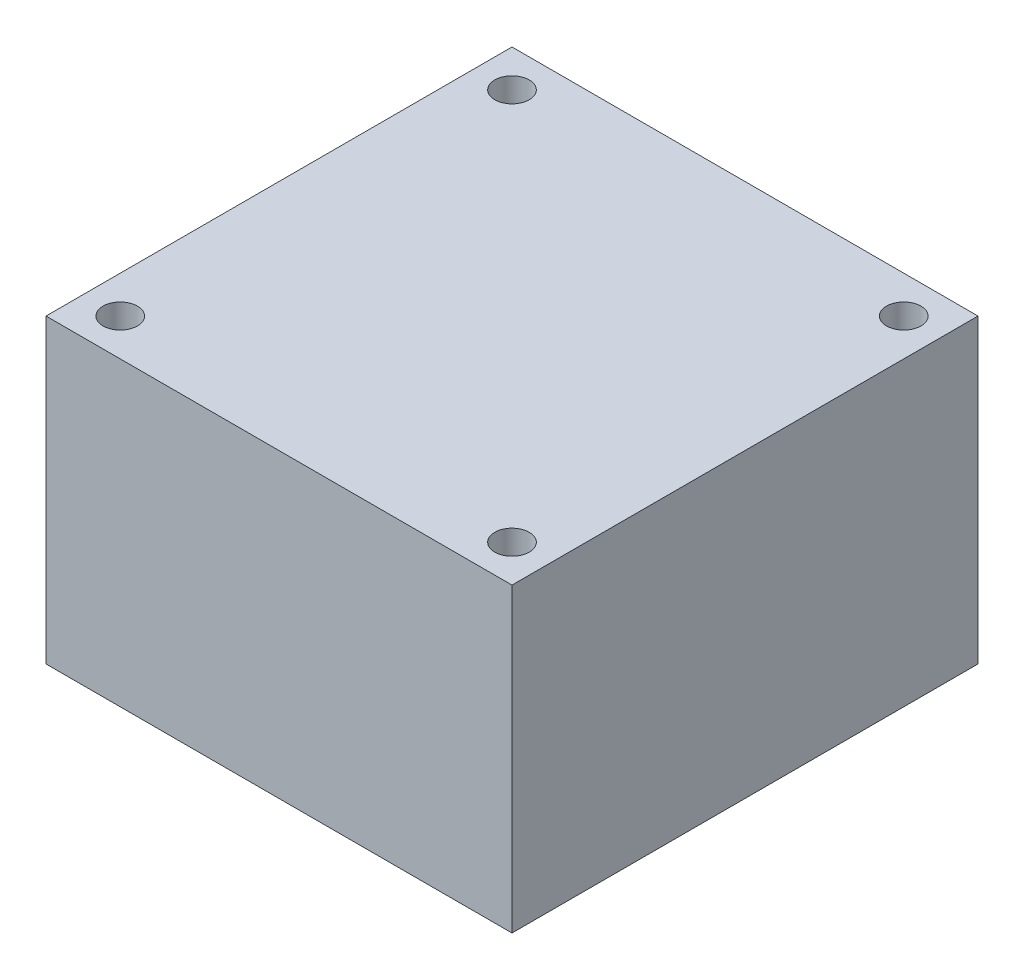
ISO-10303-21;
HEADER;
FILE_DESCRIPTION(('STEP AP214'),'2;1');
FILE_NAME('part.step','',(''),(''),'','','');
FILE_SCHEMA(('AUTOMOTIVE_DESIGN { 1 0 10303 214 1 1 1 1 }'));
ENDSEC;
DATA;
#1=APPLICATION_CONTEXT('core data for automotive mechanical design processes');
#2=APPLICATION_PROTOCOL_DEFINITION('international standard','automotive_design',2000,#1);
#3=PRODUCT_CONTEXT('',#1,'mechanical');
#4=PRODUCT('Part','Part','',(#3));
#5=PRODUCT_RELATED_PRODUCT_CATEGORY('part','',(#4));
#6=PRODUCT_DEFINITION_FORMATION('','',#4);
#7=PRODUCT_DEFINITION_CONTEXT('part definition',#1,'design');
#8=PRODUCT_DEFINITION('design','',#6,#7);
#9=PRODUCT_DEFINITION_SHAPE('','',#8);
#10=(LENGTH_UNIT() NAMED_UNIT(*) SI_UNIT(.MILLI.,.METRE.));
#11=(NAMED_UNIT(*) PLANE_ANGLE_UNIT() SI_UNIT($,.RADIAN.));
#12=(NAMED_UNIT(*) SI_UNIT($,.STERADIAN.) SOLID_ANGLE_UNIT());
#13=UNCERTAINTY_MEASURE_WITH_UNIT(LENGTH_MEASURE(1.E-05),#10,'distance_accuracy_value','');
#14=(GEOMETRIC_REPRESENTATION_CONTEXT(3) GLOBAL_UNCERTAINTY_ASSIGNED_CONTEXT((#13)) GLOBAL_UNIT_ASSIGNED_CONTEXT((#10,
#11,#12)) REPRESENTATION_CONTEXT('',''));
#15=CARTESIAN_POINT('',(0.,0.,0.));
#16=DIRECTION('',(0.,0.,1.));
#17=DIRECTION('',(1.,0.,0.));
#18=AXIS2_PLACEMENT_3D('',#15,#16,#17);
#19=CARTESIAN_POINT('',(0.,28.,0.));
#20=DIRECTION('',(0.,1.,0.));
#21=DIRECTION('',(0.,0.,1.));
#22=AXIS2_PLACEMENT_3D('',#19,#20,#21);
#23=PLANE('',#22);
#24=CARTESIAN_POINT('',(18.2,28.,18.2));
#25=DIRECTION('',(0.,1.,0.));
#26=DIRECTION('',(0.,0.,-1.));
#27=AXIS2_PLACEMENT_3D('',#24,#25,#26);
#28=CIRCLE('',#27,1.59999999999997);
#29=CARTESIAN_POINT('',(18.2,28.,16.6));
#30=VERTEX_POINT('',#29);
#31=EDGE_CURVE('E120',#30,#30,#28,.T.);
#32=ORIENTED_EDGE('',*,*,#31,.F.);
#33=EDGE_LOOP('',(#32));
#34=FACE_BOUND('',#33,.T.);
#35=CARTESIAN_POINT('',(18.2,28.,-18.2));
#36=DIRECTION('',(0.,1.,0.));
#37=DIRECTION('',(0.,0.,1.));
#38=AXIS2_PLACEMENT_3D('',#35,#36,#37);
#39=CIRCLE('',#38,1.6);
#40=CARTESIAN_POINT('',(18.2,28.,-16.6));
#41=VERTEX_POINT('',#40);
#42=EDGE_CURVE('E99',#41,#41,#39,.T.);
#43=ORIENTED_EDGE('',*,*,#42,.F.);
#44=EDGE_LOOP('',(#43));
#45=FACE_BOUND('',#44,.T.);
#46=DIRECTION('',(0.,0.,-1.));
#47=VECTOR('',#46,1.);
#48=CARTESIAN_POINT('',(21.65,28.,-21.65));
#49=LINE('',#48,#47);
#50=CARTESIAN_POINT('',(21.65,28.,21.65));
#51=VERTEX_POINT('',#50);
#52=CARTESIAN_POINT('',(21.65,28.,-21.65));
#53=VERTEX_POINT('',#52);
#54=EDGE_CURVE('E84',#51,#53,#49,.T.);
#55=ORIENTED_EDGE('',*,*,#54,.T.);
#56=DIRECTION('',(-1.,0.,0.));
#57=VECTOR('',#56,1.);
#58=CARTESIAN_POINT('',(-21.65,28.,-21.65));
#59=LINE('',#58,#57);
#60=CARTESIAN_POINT('',(-21.65,28.,-21.65));
#61=VERTEX_POINT('',#60);
#62=EDGE_CURVE('E79',#53,#61,#59,.T.);
#63=ORIENTED_EDGE('',*,*,#62,.T.);
#64=DIRECTION('',(0.,0.,1.));
#65=VECTOR('',#64,1.);
#66=CARTESIAN_POINT('',(-21.65,28.,-21.65));
#67=LINE('',#66,#65);
#68=CARTESIAN_POINT('',(-21.65,28.,21.65));
#69=VERTEX_POINT('',#68);
#70=EDGE_CURVE('E82',#61,#69,#67,.T.);
#71=ORIENTED_EDGE('',*,*,#70,.T.);
#72=DIRECTION('',(1.,0.,0.));
#73=VECTOR('',#72,1.);
#74=CARTESIAN_POINT('',(-21.65,28.,21.65));
#75=LINE('',#74,#73);
#76=EDGE_CURVE('E49',#69,#51,#75,.T.);
#77=ORIENTED_EDGE('',*,*,#76,.T.);
#78=EDGE_LOOP('',(#55,#63,#71,#77));
#79=FACE_BOUND('',#78,.T.);
#80=CARTESIAN_POINT('',(-18.2,28.,-18.2));
#81=DIRECTION('',(0.,1.,0.));
#82=DIRECTION('',(0.,0.,-1.));
#83=AXIS2_PLACEMENT_3D('',#80,#81,#82);
#84=CIRCLE('',#83,1.60000000000001);
#85=CARTESIAN_POINT('',(-18.2,28.,-19.8));
#86=VERTEX_POINT('',#85);
#87=EDGE_CURVE('E114',#86,#86,#84,.T.);
#88=ORIENTED_EDGE('',*,*,#87,.F.);
#89=EDGE_LOOP('',(#88));
#90=FACE_BOUND('',#89,.T.);
#91=CARTESIAN_POINT('',(-18.2,28.,18.2));
#92=DIRECTION('',(0.,1.,0.));
#93=DIRECTION('',(0.,0.,1.));
#94=AXIS2_PLACEMENT_3D('',#91,#92,#93);
#95=CIRCLE('',#94,1.60000000000002);
#96=CARTESIAN_POINT('',(-18.2,28.,19.8));
#97=VERTEX_POINT('',#96);
#98=EDGE_CURVE('E126',#97,#97,#95,.T.);
#99=ORIENTED_EDGE('',*,*,#98,.F.);
#100=EDGE_LOOP('',(#99));
#101=FACE_BOUND('',#100,.T.);
#102=ADVANCED_FACE('F32',(#34,#45,#79,#90,#101),#23,.T.);
#103=CARTESIAN_POINT('',(0.,0.,0.));
#104=DIRECTION('',(0.,1.,0.));
#105=DIRECTION('',(0.,0.,1.));
#106=AXIS2_PLACEMENT_3D('',#103,#104,#105);
#107=PLANE('',#106);
#108=DIRECTION('',(0.,0.,-1.));
#109=VECTOR('',#108,1.);
#110=CARTESIAN_POINT('',(21.65,0.,-21.65));
#111=LINE('',#110,#109);
#112=CARTESIAN_POINT('',(21.65,0.,21.65));
#113=VERTEX_POINT('',#112);
#114=CARTESIAN_POINT('',(21.65,0.,-21.65));
#115=VERTEX_POINT('',#114);
#116=EDGE_CURVE('E96',#113,#115,#111,.T.);
#117=ORIENTED_EDGE('',*,*,#116,.F.);
#118=DIRECTION('',(1.,0.,0.));
#119=VECTOR('',#118,1.);
#120=CARTESIAN_POINT('',(-21.65,0.,21.65));
#121=LINE('',#120,#119);
#122=CARTESIAN_POINT('',(-21.65,0.,21.65));
#123=VERTEX_POINT('',#122);
#124=EDGE_CURVE('E72',#123,#113,#121,.T.);
#125=ORIENTED_EDGE('',*,*,#124,.F.);
#126=DIRECTION('',(0.,0.,1.));
#127=VECTOR('',#126,1.);
#128=CARTESIAN_POINT('',(-21.65,0.,-21.65));
#129=LINE('',#128,#127);
#130=CARTESIAN_POINT('',(-21.65,0.,-21.65));
#131=VERTEX_POINT('',#130);
#132=EDGE_CURVE('E66',#131,#123,#129,.T.);
#133=ORIENTED_EDGE('',*,*,#132,.F.);
#134=DIRECTION('',(-1.,0.,0.));
#135=VECTOR('',#134,1.);
#136=CARTESIAN_POINT('',(-21.65,0.,-21.65));
#137=LINE('',#136,#135);
#138=EDGE_CURVE('E88',#115,#131,#137,.T.);
#139=ORIENTED_EDGE('',*,*,#138,.F.);
#140=EDGE_LOOP('',(#117,#125,#133,#139));
#141=FACE_BOUND('',#140,.T.);
#142=CARTESIAN_POINT('',(18.2,0.,-18.2));
#143=DIRECTION('',(0.,1.,0.));
#144=DIRECTION('',(0.,0.,1.));
#145=AXIS2_PLACEMENT_3D('',#142,#143,#144);
#146=CIRCLE('',#145,1.6);
#147=CARTESIAN_POINT('',(18.2,0.,-16.6));
#148=VERTEX_POINT('',#147);
#149=EDGE_CURVE('E111',#148,#148,#146,.T.);
#150=ORIENTED_EDGE('',*,*,#149,.T.);
#151=EDGE_LOOP('',(#150));
#152=FACE_BOUND('',#151,.T.);
#153=CARTESIAN_POINT('',(-18.2,0.,-18.2));
#154=DIRECTION('',(0.,1.,0.));
#155=DIRECTION('',(0.,0.,-1.));
#156=AXIS2_PLACEMENT_3D('',#153,#154,#155);
#157=CIRCLE('',#156,1.60000000000001);
#158=CARTESIAN_POINT('',(-18.2,0.,-19.8));
#159=VERTEX_POINT('',#158);
#160=EDGE_CURVE('E117',#159,#159,#157,.T.);
#161=ORIENTED_EDGE('',*,*,#160,.T.);
#162=EDGE_LOOP('',(#161));
#163=FACE_BOUND('',#162,.T.);
#164=CARTESIAN_POINT('',(18.2,0.,18.2));
#165=DIRECTION('',(0.,1.,0.));
#166=DIRECTION('',(0.,0.,-1.));
#167=AXIS2_PLACEMENT_3D('',#164,#165,#166);
#168=CIRCLE('',#167,1.59999999999997);
#169=CARTESIAN_POINT('',(18.2,0.,16.6));
#170=VERTEX_POINT('',#169);
#171=EDGE_CURVE('E123',#170,#170,#168,.T.);
#172=ORIENTED_EDGE('',*,*,#171,.T.);
#173=EDGE_LOOP('',(#172));
#174=FACE_BOUND('',#173,.T.);
#175=CARTESIAN_POINT('',(-18.2,0.,18.2));
#176=DIRECTION('',(0.,1.,0.));
#177=DIRECTION('',(0.,0.,1.));
#178=AXIS2_PLACEMENT_3D('',#175,#176,#177);
#179=CIRCLE('',#178,1.60000000000002);
#180=CARTESIAN_POINT('',(-18.2,0.,19.8));
#181=VERTEX_POINT('',#180);
#182=EDGE_CURVE('E129',#181,#181,#179,.T.);
#183=ORIENTED_EDGE('',*,*,#182,.T.);
#184=EDGE_LOOP('',(#183));
#185=FACE_BOUND('',#184,.T.);
#186=ADVANCED_FACE('F107',(#141,#152,#163,#174,#185),#107,.F.);
#187=CARTESIAN_POINT('',(21.65,28.,-21.65));
#188=DIRECTION('',(-1.,0.,0.));
#189=DIRECTION('',(0.,0.,1.));
#190=AXIS2_PLACEMENT_3D('',#187,#188,#189);
#191=PLANE('',#190);
#192=ORIENTED_EDGE('',*,*,#116,.T.);
#193=DIRECTION('',(0.,-1.,0.));
#194=VECTOR('',#193,1.);
#195=CARTESIAN_POINT('',(21.65,28.,-21.65));
#196=LINE('',#195,#194);
#197=EDGE_CURVE('E11',#53,#115,#196,.T.);
#198=ORIENTED_EDGE('',*,*,#197,.F.);
#199=ORIENTED_EDGE('',*,*,#54,.F.);
#200=DIRECTION('',(0.,-1.,0.));
#201=VECTOR('',#200,1.);
#202=CARTESIAN_POINT('',(21.65,28.,21.65));
#203=LINE('',#202,#201);
#204=EDGE_CURVE('E92',#51,#113,#203,.T.);
#205=ORIENTED_EDGE('',*,*,#204,.T.);
#206=EDGE_LOOP('',(#192,#198,#199,#205));
#207=FACE_BOUND('',#206,.T.);
#208=ADVANCED_FACE('F34',(#207),#191,.F.);
#209=CARTESIAN_POINT('',(-21.65,28.,-21.65));
#210=DIRECTION('',(0.,0.,1.));
#211=DIRECTION('',(1.,0.,0.));
#212=AXIS2_PLACEMENT_3D('',#209,#210,#211);
#213=PLANE('',#212);
#214=ORIENTED_EDGE('',*,*,#138,.T.);
#215=DIRECTION('',(0.,-1.,0.));
#216=VECTOR('',#215,1.);
#217=CARTESIAN_POINT('',(-21.65,28.,-21.65));
#218=LINE('',#217,#216);
#219=EDGE_CURVE('E41',#61,#131,#218,.T.);
#220=ORIENTED_EDGE('',*,*,#219,.F.);
#221=ORIENTED_EDGE('',*,*,#62,.F.);
#222=ORIENTED_EDGE('',*,*,#197,.T.);
#223=EDGE_LOOP('',(#214,#220,#221,#222));
#224=FACE_BOUND('',#223,.T.);
#225=ADVANCED_FACE('F87',(#224),#213,.F.);
#226=CARTESIAN_POINT('',(-21.65,28.,-21.65));
#227=DIRECTION('',(1.,0.,0.));
#228=DIRECTION('',(0.,0.,-1.));
#229=AXIS2_PLACEMENT_3D('',#226,#227,#228);
#230=PLANE('',#229);
#231=ORIENTED_EDGE('',*,*,#132,.T.);
#232=DIRECTION('',(0.,-1.,0.));
#233=VECTOR('',#232,1.);
#234=CARTESIAN_POINT('',(-21.65,28.,21.65));
#235=LINE('',#234,#233);
#236=EDGE_CURVE('E89',#69,#123,#235,.T.);
#237=ORIENTED_EDGE('',*,*,#236,.F.);
#238=ORIENTED_EDGE('',*,*,#70,.F.);
#239=ORIENTED_EDGE('',*,*,#219,.T.);
#240=EDGE_LOOP('',(#231,#237,#238,#239));
#241=FACE_BOUND('',#240,.T.);
#242=ADVANCED_FACE('F90',(#241),#230,.F.);
#243=CARTESIAN_POINT('',(-21.65,28.,21.65));
#244=DIRECTION('',(0.,0.,-1.));
#245=DIRECTION('',(-1.,0.,0.));
#246=AXIS2_PLACEMENT_3D('',#243,#244,#245);
#247=PLANE('',#246);
#248=ORIENTED_EDGE('',*,*,#124,.T.);
#249=ORIENTED_EDGE('',*,*,#204,.F.);
#250=ORIENTED_EDGE('',*,*,#76,.F.);
#251=ORIENTED_EDGE('',*,*,#236,.T.);
#252=EDGE_LOOP('',(#248,#249,#250,#251));
#253=FACE_BOUND('',#252,.T.);
#254=ADVANCED_FACE('F104',(#253),#247,.F.);
#255=CARTESIAN_POINT('',(18.2,28.,-18.2));
#256=DIRECTION('',(0.,-1.,0.));
#257=DIRECTION('',(0.,0.,-1.));
#258=AXIS2_PLACEMENT_3D('',#255,#256,#257);
#259=CYLINDRICAL_SURFACE('',#258,1.6);
#260=ORIENTED_EDGE('',*,*,#42,.T.);
#261=EDGE_LOOP('',(#260));
#262=FACE_BOUND('',#261,.T.);
#263=ORIENTED_EDGE('',*,*,#149,.F.);
#264=EDGE_LOOP('',(#263));
#265=FACE_BOUND('',#264,.T.);
#266=ADVANCED_FACE('F148',(#262,#265),#259,.F.);
#267=CARTESIAN_POINT('',(-18.2,28.,-18.2));
#268=DIRECTION('',(0.,-1.,0.));
#269=DIRECTION('',(0.,0.,-1.));
#270=AXIS2_PLACEMENT_3D('',#267,#268,#269);
#271=CYLINDRICAL_SURFACE('',#270,1.60000000000001);
#272=ORIENTED_EDGE('',*,*,#87,.T.);
#273=EDGE_LOOP('',(#272));
#274=FACE_BOUND('',#273,.T.);
#275=ORIENTED_EDGE('',*,*,#160,.F.);
#276=EDGE_LOOP('',(#275));
#277=FACE_BOUND('',#276,.T.);
#278=ADVANCED_FACE('F194',(#274,#277),#271,.F.);
#279=CARTESIAN_POINT('',(18.2,28.,18.2));
#280=DIRECTION('',(0.,-1.,0.));
#281=DIRECTION('',(0.,0.,-1.));
#282=AXIS2_PLACEMENT_3D('',#279,#280,#281);
#283=CYLINDRICAL_SURFACE('',#282,1.59999999999997);
#284=ORIENTED_EDGE('',*,*,#31,.T.);
#285=EDGE_LOOP('',(#284));
#286=FACE_BOUND('',#285,.T.);
#287=ORIENTED_EDGE('',*,*,#171,.F.);
#288=EDGE_LOOP('',(#287));
#289=FACE_BOUND('',#288,.T.);
#290=ADVANCED_FACE('F202',(#286,#289),#283,.F.);
#291=CARTESIAN_POINT('',(-18.2,28.,18.2));
#292=DIRECTION('',(0.,-1.,0.));
#293=DIRECTION('',(0.,0.,-1.));
#294=AXIS2_PLACEMENT_3D('',#291,#292,#293);
#295=CYLINDRICAL_SURFACE('',#294,1.60000000000002);
#296=ORIENTED_EDGE('',*,*,#98,.T.);
#297=EDGE_LOOP('',(#296));
#298=FACE_BOUND('',#297,.T.);
#299=ORIENTED_EDGE('',*,*,#182,.F.);
#300=EDGE_LOOP('',(#299));
#301=FACE_BOUND('',#300,.T.);
#302=ADVANCED_FACE('F135',(#298,#301),#295,.F.);
#303=CLOSED_SHELL('',(#102,#186,#208,#225,#242,#254,#266,#278,#290,#302));
#304=MANIFOLD_SOLID_BREP('B2',#303);
#305=ADVANCED_BREP_SHAPE_REPRESENTATION('',(#18,#304),#14);
#306=SHAPE_DEFINITION_REPRESENTATION(#9,#305);
ENDSEC;
END-ISO-10303-21;
